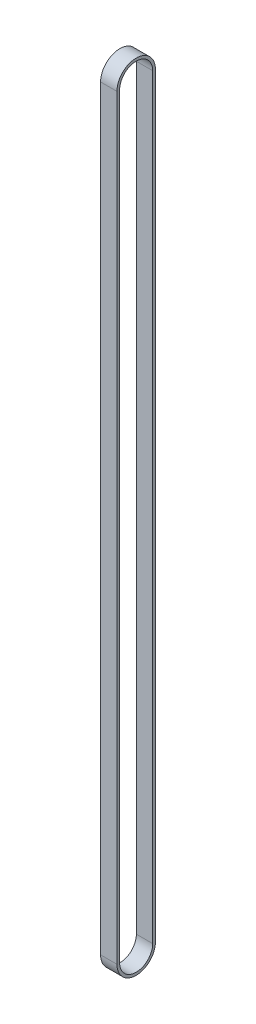
ISO-10303-21;
HEADER;
FILE_DESCRIPTION(('STEP AP214'),'2;1');
FILE_NAME('part.step','',(''),(''),'','','');
FILE_SCHEMA(('AUTOMOTIVE_DESIGN { 1 0 10303 214 1 1 1 1 }'));
ENDSEC;
DATA;
#1=APPLICATION_CONTEXT('core data for automotive mechanical design processes');
#2=APPLICATION_PROTOCOL_DEFINITION('international standard','automotive_design',2000,#1);
#3=PRODUCT_CONTEXT('',#1,'mechanical');
#4=PRODUCT('Part','Part','',(#3));
#5=PRODUCT_RELATED_PRODUCT_CATEGORY('part','',(#4));
#6=PRODUCT_DEFINITION_FORMATION('','',#4);
#7=PRODUCT_DEFINITION_CONTEXT('part definition',#1,'design');
#8=PRODUCT_DEFINITION('design','',#6,#7);
#9=PRODUCT_DEFINITION_SHAPE('','',#8);
#10=(LENGTH_UNIT() NAMED_UNIT(*) SI_UNIT(.MILLI.,.METRE.));
#11=(NAMED_UNIT(*) PLANE_ANGLE_UNIT() SI_UNIT($,.RADIAN.));
#12=(NAMED_UNIT(*) SI_UNIT($,.STERADIAN.) SOLID_ANGLE_UNIT());
#13=UNCERTAINTY_MEASURE_WITH_UNIT(LENGTH_MEASURE(1.E-05),#10,'distance_accuracy_value','');
#14=(GEOMETRIC_REPRESENTATION_CONTEXT(3) GLOBAL_UNCERTAINTY_ASSIGNED_CONTEXT((#13)) GLOBAL_UNIT_ASSIGNED_CONTEXT((#10,
#11,#12)) REPRESENTATION_CONTEXT('',''));
#15=CARTESIAN_POINT('',(0.,0.,0.));
#16=DIRECTION('',(0.,0.,1.));
#17=DIRECTION('',(1.,0.,0.));
#18=AXIS2_PLACEMENT_3D('',#15,#16,#17);
#19=CARTESIAN_POINT('',(6.05,-140.,0.));
#20=DIRECTION('',(1.,0.,0.));
#21=DIRECTION('',(0.,0.,-1.));
#22=AXIS2_PLACEMENT_3D('',#19,#20,#21);
#23=PLANE('',#22);
#24=CARTESIAN_POINT('',(6.05,-140.,0.));
#25=DIRECTION('',(1.,0.,0.));
#26=DIRECTION('',(0.,0.,-1.));
#27=AXIS2_PLACEMENT_3D('',#24,#25,#26);
#28=CIRCLE('',#27,7.12500000000005);
#29=CARTESIAN_POINT('',(6.05,-140.,7.12500000000005));
#30=VERTEX_POINT('',#29);
#31=CARTESIAN_POINT('',(6.05,-140.,-7.12500000000005));
#32=VERTEX_POINT('',#31);
#33=EDGE_CURVE('E157',#30,#32,#28,.T.);
#34=ORIENTED_EDGE('',*,*,#33,.T.);
#35=DIRECTION('',(0.,1.,0.));
#36=VECTOR('',#35,1.);
#37=CARTESIAN_POINT('',(6.05,-140.,-7.12500000000005));
#38=LINE('',#37,#36);
#39=CARTESIAN_POINT('',(6.05,140.,-7.12499999999995));
#40=VERTEX_POINT('',#39);
#41=EDGE_CURVE('E162',#32,#40,#38,.T.);
#42=ORIENTED_EDGE('',*,*,#41,.T.);
#43=CARTESIAN_POINT('',(6.05,140.,0.));
#44=DIRECTION('',(1.,0.,0.));
#45=DIRECTION('',(0.,0.,-1.));
#46=AXIS2_PLACEMENT_3D('',#43,#44,#45);
#47=CIRCLE('',#46,7.125);
#48=CARTESIAN_POINT('',(6.05,140.,7.12500000000005));
#49=VERTEX_POINT('',#48);
#50=EDGE_CURVE('E170',#40,#49,#47,.T.);
#51=ORIENTED_EDGE('',*,*,#50,.T.);
#52=DIRECTION('',(0.,-1.,0.));
#53=VECTOR('',#52,1.);
#54=CARTESIAN_POINT('',(6.05,-140.,7.12500000000005));
#55=LINE('',#54,#53);
#56=EDGE_CURVE('E168',#49,#30,#55,.T.);
#57=ORIENTED_EDGE('',*,*,#56,.T.);
#58=EDGE_LOOP('',(#34,#42,#51,#57));
#59=FACE_BOUND('',#58,.T.);
#60=DIRECTION('',(0.,1.,0.));
#61=VECTOR('',#60,1.);
#62=CARTESIAN_POINT('',(6.05,-140.,-6.12500000000005));
#63=LINE('',#62,#61);
#64=CARTESIAN_POINT('',(6.05,-140.,-6.12500000000005));
#65=VERTEX_POINT('',#64);
#66=CARTESIAN_POINT('',(6.05,140.,-6.125));
#67=VERTEX_POINT('',#66);
#68=EDGE_CURVE('E116',#65,#67,#63,.T.);
#69=ORIENTED_EDGE('',*,*,#68,.F.);
#70=CARTESIAN_POINT('',(6.05,-140.,0.));
#71=DIRECTION('',(1.,0.,0.));
#72=DIRECTION('',(0.,0.,-1.));
#73=AXIS2_PLACEMENT_3D('',#70,#71,#72);
#74=CIRCLE('',#73,6.12500000000005);
#75=CARTESIAN_POINT('',(6.05,-140.,6.12500000000005));
#76=VERTEX_POINT('',#75);
#77=EDGE_CURVE('E112',#76,#65,#74,.T.);
#78=ORIENTED_EDGE('',*,*,#77,.F.);
#79=DIRECTION('',(0.,-1.,0.));
#80=VECTOR('',#79,1.);
#81=CARTESIAN_POINT('',(6.05,-140.,6.12500000000005));
#82=LINE('',#81,#80);
#83=CARTESIAN_POINT('',(6.05,140.,6.1250000000001));
#84=VERTEX_POINT('',#83);
#85=EDGE_CURVE('E139',#84,#76,#82,.T.);
#86=ORIENTED_EDGE('',*,*,#85,.F.);
#87=CARTESIAN_POINT('',(6.05,140.,0.));
#88=DIRECTION('',(1.,0.,0.));
#89=DIRECTION('',(0.,0.,-1.));
#90=AXIS2_PLACEMENT_3D('',#87,#88,#89);
#91=CIRCLE('',#90,6.12500000000005);
#92=EDGE_CURVE('E132',#67,#84,#91,.T.);
#93=ORIENTED_EDGE('',*,*,#92,.F.);
#94=EDGE_LOOP('',(#69,#78,#86,#93));
#95=FACE_BOUND('',#94,.T.);
#96=ADVANCED_FACE('F44',(#59,#95),#23,.T.);
#97=CARTESIAN_POINT('',(0.,-140.,0.));
#98=DIRECTION('',(1.,0.,0.));
#99=DIRECTION('',(0.,0.,-1.));
#100=AXIS2_PLACEMENT_3D('',#97,#98,#99);
#101=PLANE('',#100);
#102=CARTESIAN_POINT('',(0.,-140.,0.));
#103=DIRECTION('',(1.,0.,0.));
#104=DIRECTION('',(0.,0.,-1.));
#105=AXIS2_PLACEMENT_3D('',#102,#103,#104);
#106=CIRCLE('',#105,7.12500000000005);
#107=CARTESIAN_POINT('',(0.,-140.,7.12500000000005));
#108=VERTEX_POINT('',#107);
#109=CARTESIAN_POINT('',(0.,-140.,-7.12500000000005));
#110=VERTEX_POINT('',#109);
#111=EDGE_CURVE('E129',#108,#110,#106,.T.);
#112=ORIENTED_EDGE('',*,*,#111,.F.);
#113=DIRECTION('',(0.,-1.,0.));
#114=VECTOR('',#113,1.);
#115=CARTESIAN_POINT('',(0.,-140.,7.12500000000005));
#116=LINE('',#115,#114);
#117=CARTESIAN_POINT('',(0.,140.,7.12500000000005));
#118=VERTEX_POINT('',#117);
#119=EDGE_CURVE('E163',#118,#108,#116,.T.);
#120=ORIENTED_EDGE('',*,*,#119,.F.);
#121=CARTESIAN_POINT('',(0.,140.,0.));
#122=DIRECTION('',(1.,0.,0.));
#123=DIRECTION('',(0.,0.,-1.));
#124=AXIS2_PLACEMENT_3D('',#121,#122,#123);
#125=CIRCLE('',#124,7.125);
#126=CARTESIAN_POINT('',(0.,140.,-7.12499999999995));
#127=VERTEX_POINT('',#126);
#128=EDGE_CURVE('E178',#127,#118,#125,.T.);
#129=ORIENTED_EDGE('',*,*,#128,.F.);
#130=DIRECTION('',(0.,1.,0.));
#131=VECTOR('',#130,1.);
#132=CARTESIAN_POINT('',(0.,-140.,-7.12500000000005));
#133=LINE('',#132,#131);
#134=EDGE_CURVE('E179',#110,#127,#133,.T.);
#135=ORIENTED_EDGE('',*,*,#134,.F.);
#136=EDGE_LOOP('',(#112,#120,#129,#135));
#137=FACE_BOUND('',#136,.T.);
#138=CARTESIAN_POINT('',(0.,-140.,0.));
#139=DIRECTION('',(1.,0.,0.));
#140=DIRECTION('',(0.,0.,-1.));
#141=AXIS2_PLACEMENT_3D('',#138,#139,#140);
#142=CIRCLE('',#141,6.12500000000005);
#143=CARTESIAN_POINT('',(0.,-140.,6.12500000000005));
#144=VERTEX_POINT('',#143);
#145=CARTESIAN_POINT('',(0.,-140.,-6.12500000000005));
#146=VERTEX_POINT('',#145);
#147=EDGE_CURVE('E66',#144,#146,#142,.T.);
#148=ORIENTED_EDGE('',*,*,#147,.T.);
#149=DIRECTION('',(0.,1.,0.));
#150=VECTOR('',#149,1.);
#151=CARTESIAN_POINT('',(0.,-140.,-6.12500000000005));
#152=LINE('',#151,#150);
#153=CARTESIAN_POINT('',(0.,140.,-6.125));
#154=VERTEX_POINT('',#153);
#155=EDGE_CURVE('E130',#146,#154,#152,.T.);
#156=ORIENTED_EDGE('',*,*,#155,.T.);
#157=CARTESIAN_POINT('',(0.,140.,0.));
#158=DIRECTION('',(1.,0.,0.));
#159=DIRECTION('',(0.,0.,-1.));
#160=AXIS2_PLACEMENT_3D('',#157,#158,#159);
#161=CIRCLE('',#160,6.12500000000005);
#162=CARTESIAN_POINT('',(0.,140.,6.1250000000001));
#163=VERTEX_POINT('',#162);
#164=EDGE_CURVE('E148',#154,#163,#161,.T.);
#165=ORIENTED_EDGE('',*,*,#164,.T.);
#166=DIRECTION('',(0.,-1.,0.));
#167=VECTOR('',#166,1.);
#168=CARTESIAN_POINT('',(0.,-140.,6.12500000000005));
#169=LINE('',#168,#167);
#170=EDGE_CURVE('E122',#163,#144,#169,.T.);
#171=ORIENTED_EDGE('',*,*,#170,.T.);
#172=EDGE_LOOP('',(#148,#156,#165,#171));
#173=FACE_BOUND('',#172,.T.);
#174=ADVANCED_FACE('F201',(#137,#173),#101,.F.);
#175=CARTESIAN_POINT('',(6.05,-140.,0.));
#176=DIRECTION('',(-1.,0.,0.));
#177=DIRECTION('',(0.,0.,1.));
#178=AXIS2_PLACEMENT_3D('',#175,#176,#177);
#179=CYLINDRICAL_SURFACE('',#178,7.12500000000005);
#180=ORIENTED_EDGE('',*,*,#111,.T.);
#181=DIRECTION('',(-1.,0.,0.));
#182=VECTOR('',#181,1.);
#183=CARTESIAN_POINT('',(6.05,-140.,-7.12500000000005));
#184=LINE('',#183,#182);
#185=EDGE_CURVE('E11',#32,#110,#184,.T.);
#186=ORIENTED_EDGE('',*,*,#185,.F.);
#187=ORIENTED_EDGE('',*,*,#33,.F.);
#188=DIRECTION('',(-1.,0.,0.));
#189=VECTOR('',#188,1.);
#190=CARTESIAN_POINT('',(6.05,-140.,7.12500000000005));
#191=LINE('',#190,#189);
#192=EDGE_CURVE('E172',#30,#108,#191,.T.);
#193=ORIENTED_EDGE('',*,*,#192,.T.);
#194=EDGE_LOOP('',(#180,#186,#187,#193));
#195=FACE_BOUND('',#194,.T.);
#196=ADVANCED_FACE('F50',(#195),#179,.T.);
#197=CARTESIAN_POINT('',(6.05,-140.,-7.12500000000005));
#198=DIRECTION('',(0.,0.,1.));
#199=DIRECTION('',(0.,-1.,0.));
#200=AXIS2_PLACEMENT_3D('',#197,#198,#199);
#201=PLANE('',#200);
#202=ORIENTED_EDGE('',*,*,#134,.T.);
#203=DIRECTION('',(-1.,0.,0.));
#204=VECTOR('',#203,1.);
#205=CARTESIAN_POINT('',(6.05,140.,-7.12499999999995));
#206=LINE('',#205,#204);
#207=EDGE_CURVE('E53',#40,#127,#206,.T.);
#208=ORIENTED_EDGE('',*,*,#207,.F.);
#209=ORIENTED_EDGE('',*,*,#41,.F.);
#210=ORIENTED_EDGE('',*,*,#185,.T.);
#211=EDGE_LOOP('',(#202,#208,#209,#210));
#212=FACE_BOUND('',#211,.T.);
#213=ADVANCED_FACE('F213',(#212),#201,.F.);
#214=CARTESIAN_POINT('',(6.05,140.,0.));
#215=DIRECTION('',(-1.,0.,0.));
#216=DIRECTION('',(0.,0.,1.));
#217=AXIS2_PLACEMENT_3D('',#214,#215,#216);
#218=CYLINDRICAL_SURFACE('',#217,7.125);
#219=ORIENTED_EDGE('',*,*,#128,.T.);
#220=DIRECTION('',(-1.,0.,0.));
#221=VECTOR('',#220,1.);
#222=CARTESIAN_POINT('',(6.05,140.,7.12500000000005));
#223=LINE('',#222,#221);
#224=EDGE_CURVE('E187',#49,#118,#223,.T.);
#225=ORIENTED_EDGE('',*,*,#224,.F.);
#226=ORIENTED_EDGE('',*,*,#50,.F.);
#227=ORIENTED_EDGE('',*,*,#207,.T.);
#228=EDGE_LOOP('',(#219,#225,#226,#227));
#229=FACE_BOUND('',#228,.T.);
#230=ADVANCED_FACE('F197',(#229),#218,.T.);
#231=CARTESIAN_POINT('',(6.05,-140.,7.12500000000005));
#232=DIRECTION('',(0.,0.,-1.));
#233=DIRECTION('',(-1.,0.,0.));
#234=AXIS2_PLACEMENT_3D('',#231,#232,#233);
#235=PLANE('',#234);
#236=ORIENTED_EDGE('',*,*,#119,.T.);
#237=ORIENTED_EDGE('',*,*,#192,.F.);
#238=ORIENTED_EDGE('',*,*,#56,.F.);
#239=ORIENTED_EDGE('',*,*,#224,.T.);
#240=EDGE_LOOP('',(#236,#237,#238,#239));
#241=FACE_BOUND('',#240,.T.);
#242=ADVANCED_FACE('F210',(#241),#235,.F.);
#243=CARTESIAN_POINT('',(6.05,-140.,0.));
#244=DIRECTION('',(-1.,0.,0.));
#245=DIRECTION('',(0.,0.,1.));
#246=AXIS2_PLACEMENT_3D('',#243,#244,#245);
#247=CYLINDRICAL_SURFACE('',#246,6.12500000000005);
#248=ORIENTED_EDGE('',*,*,#147,.F.);
#249=DIRECTION('',(-1.,0.,0.));
#250=VECTOR('',#249,1.);
#251=CARTESIAN_POINT('',(6.05,-140.,6.12500000000005));
#252=LINE('',#251,#250);
#253=EDGE_CURVE('E113',#76,#144,#252,.T.);
#254=ORIENTED_EDGE('',*,*,#253,.F.);
#255=ORIENTED_EDGE('',*,*,#77,.T.);
#256=DIRECTION('',(-1.,0.,0.));
#257=VECTOR('',#256,1.);
#258=CARTESIAN_POINT('',(6.05,-140.,-6.12500000000005));
#259=LINE('',#258,#257);
#260=EDGE_CURVE('E111',#65,#146,#259,.T.);
#261=ORIENTED_EDGE('',*,*,#260,.T.);
#262=EDGE_LOOP('',(#248,#254,#255,#261));
#263=FACE_BOUND('',#262,.T.);
#264=ADVANCED_FACE('F114',(#263),#247,.F.);
#265=CARTESIAN_POINT('',(6.05,-140.,-6.12500000000005));
#266=DIRECTION('',(0.,0.,1.));
#267=DIRECTION('',(0.,-1.,0.));
#268=AXIS2_PLACEMENT_3D('',#265,#266,#267);
#269=PLANE('',#268);
#270=ORIENTED_EDGE('',*,*,#155,.F.);
#271=ORIENTED_EDGE('',*,*,#260,.F.);
#272=ORIENTED_EDGE('',*,*,#68,.T.);
#273=DIRECTION('',(-1.,0.,0.));
#274=VECTOR('',#273,1.);
#275=CARTESIAN_POINT('',(6.05,140.,-6.125));
#276=LINE('',#275,#274);
#277=EDGE_CURVE('E128',#67,#154,#276,.T.);
#278=ORIENTED_EDGE('',*,*,#277,.T.);
#279=EDGE_LOOP('',(#270,#271,#272,#278));
#280=FACE_BOUND('',#279,.T.);
#281=ADVANCED_FACE('F121',(#280),#269,.T.);
#282=CARTESIAN_POINT('',(6.05,140.,0.));
#283=DIRECTION('',(-1.,0.,0.));
#284=DIRECTION('',(0.,0.,1.));
#285=AXIS2_PLACEMENT_3D('',#282,#283,#284);
#286=CYLINDRICAL_SURFACE('',#285,6.12500000000005);
#287=ORIENTED_EDGE('',*,*,#164,.F.);
#288=ORIENTED_EDGE('',*,*,#277,.F.);
#289=ORIENTED_EDGE('',*,*,#92,.T.);
#290=DIRECTION('',(-1.,0.,0.));
#291=VECTOR('',#290,1.);
#292=CARTESIAN_POINT('',(6.05,140.,6.1250000000001));
#293=LINE('',#292,#291);
#294=EDGE_CURVE('E63',#84,#163,#293,.T.);
#295=ORIENTED_EDGE('',*,*,#294,.T.);
#296=EDGE_LOOP('',(#287,#288,#289,#295));
#297=FACE_BOUND('',#296,.T.);
#298=ADVANCED_FACE('F237',(#297),#286,.F.);
#299=CARTESIAN_POINT('',(6.05,-140.,6.12500000000005));
#300=DIRECTION('',(0.,0.,-1.));
#301=DIRECTION('',(0.,1.,0.));
#302=AXIS2_PLACEMENT_3D('',#299,#300,#301);
#303=PLANE('',#302);
#304=ORIENTED_EDGE('',*,*,#170,.F.);
#305=ORIENTED_EDGE('',*,*,#294,.F.);
#306=ORIENTED_EDGE('',*,*,#85,.T.);
#307=ORIENTED_EDGE('',*,*,#253,.T.);
#308=EDGE_LOOP('',(#304,#305,#306,#307));
#309=FACE_BOUND('',#308,.T.);
#310=ADVANCED_FACE('F238',(#309),#303,.T.);
#311=CLOSED_SHELL('',(#96,#174,#196,#213,#230,#242,#264,#281,#298,#310));
#312=MANIFOLD_SOLID_BREP('B2',#311);
#313=ADVANCED_BREP_SHAPE_REPRESENTATION('',(#18,#312),#14);
#314=SHAPE_DEFINITION_REPRESENTATION(#9,#313);
ENDSEC;
END-ISO-10303-21;
